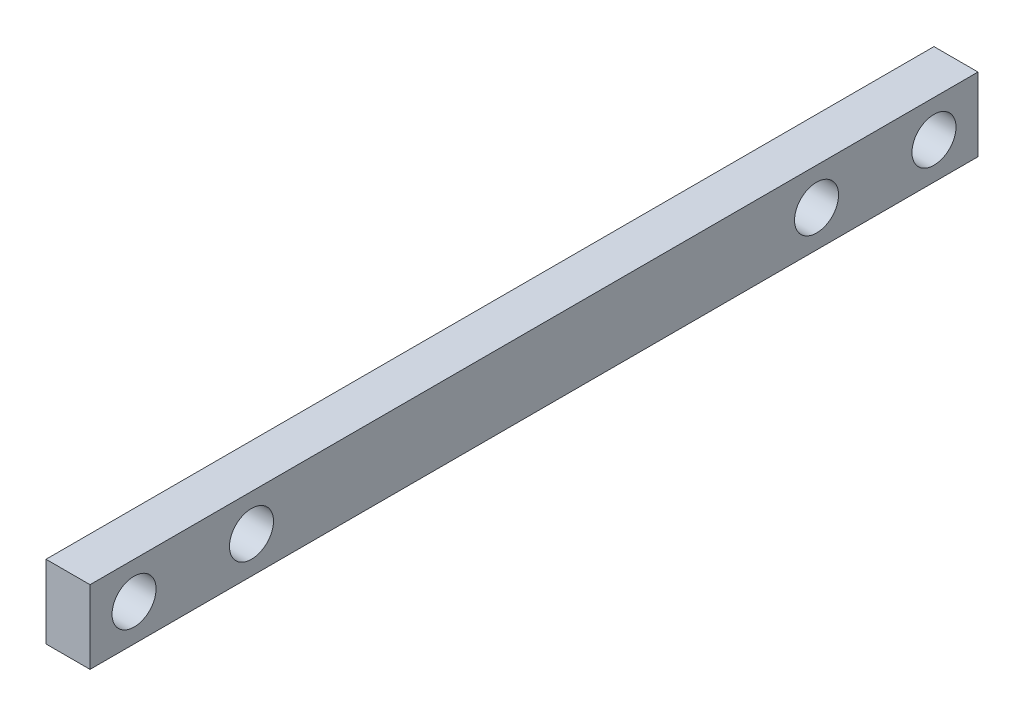
ISO-10303-21;
HEADER;
FILE_DESCRIPTION(('STEP AP214'),'2;1');
FILE_NAME('part.step','',(''),(''),'','','');
FILE_SCHEMA(('AUTOMOTIVE_DESIGN { 1 0 10303 214 1 1 1 1 }'));
ENDSEC;
DATA;
#1=APPLICATION_CONTEXT('core data for automotive mechanical design processes');
#2=APPLICATION_PROTOCOL_DEFINITION('international standard','automotive_design',2000,#1);
#3=PRODUCT_CONTEXT('',#1,'mechanical');
#4=PRODUCT('Part','Part','',(#3));
#5=PRODUCT_RELATED_PRODUCT_CATEGORY('part','',(#4));
#6=PRODUCT_DEFINITION_FORMATION('','',#4);
#7=PRODUCT_DEFINITION_CONTEXT('part definition',#1,'design');
#8=PRODUCT_DEFINITION('design','',#6,#7);
#9=PRODUCT_DEFINITION_SHAPE('','',#8);
#10=(LENGTH_UNIT() NAMED_UNIT(*) SI_UNIT(.MILLI.,.METRE.));
#11=(NAMED_UNIT(*) PLANE_ANGLE_UNIT() SI_UNIT($,.RADIAN.));
#12=(NAMED_UNIT(*) SI_UNIT($,.STERADIAN.) SOLID_ANGLE_UNIT());
#13=UNCERTAINTY_MEASURE_WITH_UNIT(LENGTH_MEASURE(1.E-05),#10,'distance_accuracy_value','');
#14=(GEOMETRIC_REPRESENTATION_CONTEXT(3) GLOBAL_UNCERTAINTY_ASSIGNED_CONTEXT((#13)) GLOBAL_UNIT_ASSIGNED_CONTEXT((#10,
#11,#12)) REPRESENTATION_CONTEXT('',''));
#15=CARTESIAN_POINT('',(0.,0.,0.));
#16=DIRECTION('',(0.,0.,1.));
#17=DIRECTION('',(1.,0.,0.));
#18=AXIS2_PLACEMENT_3D('',#15,#16,#17);
#19=CARTESIAN_POINT('',(3.,0.,0.));
#20=DIRECTION('',(-1.,0.,0.));
#21=DIRECTION('',(0.,0.,1.));
#22=AXIS2_PLACEMENT_3D('',#19,#20,#21);
#23=PLANE('',#22);
#24=DIRECTION('',(0.,1.,0.));
#25=VECTOR('',#24,1.);
#26=CARTESIAN_POINT('',(3.,-2.49999999999999,-30.25));
#27=LINE('',#26,#25);
#28=CARTESIAN_POINT('',(3.,-2.49999999999999,-30.25));
#29=VERTEX_POINT('',#28);
#30=CARTESIAN_POINT('',(3.,2.49999999999999,-30.25));
#31=VERTEX_POINT('',#30);
#32=EDGE_CURVE('E85',#29,#31,#27,.T.);
#33=ORIENTED_EDGE('',*,*,#32,.T.);
#34=DIRECTION('',(0.,0.,1.));
#35=VECTOR('',#34,1.);
#36=CARTESIAN_POINT('',(3.,2.49999999999999,30.25));
#37=LINE('',#36,#35);
#38=CARTESIAN_POINT('',(3.,2.49999999999999,30.25));
#39=VERTEX_POINT('',#38);
#40=EDGE_CURVE('E80',#31,#39,#37,.T.);
#41=ORIENTED_EDGE('',*,*,#40,.T.);
#42=DIRECTION('',(0.,-1.,0.));
#43=VECTOR('',#42,1.);
#44=CARTESIAN_POINT('',(3.,-2.5,30.25));
#45=LINE('',#44,#43);
#46=CARTESIAN_POINT('',(3.,-2.5,30.25));
#47=VERTEX_POINT('',#46);
#48=EDGE_CURVE('E83',#39,#47,#45,.T.);
#49=ORIENTED_EDGE('',*,*,#48,.T.);
#50=DIRECTION('',(0.,0.,-1.));
#51=VECTOR('',#50,1.);
#52=CARTESIAN_POINT('',(3.,-2.5,30.25));
#53=LINE('',#52,#51);
#54=EDGE_CURVE('E50',#47,#29,#53,.T.);
#55=ORIENTED_EDGE('',*,*,#54,.T.);
#56=EDGE_LOOP('',(#33,#41,#49,#55));
#57=FACE_BOUND('',#56,.T.);
#58=CARTESIAN_POINT('',(3.,0.,27.25));
#59=DIRECTION('',(1.,0.,0.));
#60=DIRECTION('',(0.,0.,-1.));
#61=AXIS2_PLACEMENT_3D('',#58,#59,#60);
#62=CIRCLE('',#61,1.5);
#63=CARTESIAN_POINT('',(3.,0.,25.75));
#64=VERTEX_POINT('',#63);
#65=EDGE_CURVE('E100',#64,#64,#62,.T.);
#66=ORIENTED_EDGE('',*,*,#65,.F.);
#67=EDGE_LOOP('',(#66));
#68=FACE_BOUND('',#67,.T.);
#69=CARTESIAN_POINT('',(3.,0.,19.25));
#70=DIRECTION('',(1.,0.,0.));
#71=DIRECTION('',(0.,0.,-1.));
#72=AXIS2_PLACEMENT_3D('',#69,#70,#71);
#73=CIRCLE('',#72,1.5);
#74=CARTESIAN_POINT('',(3.,0.,17.75));
#75=VERTEX_POINT('',#74);
#76=EDGE_CURVE('E115',#75,#75,#73,.T.);
#77=ORIENTED_EDGE('',*,*,#76,.F.);
#78=EDGE_LOOP('',(#77));
#79=FACE_BOUND('',#78,.T.);
#80=CARTESIAN_POINT('',(3.,0.,-27.25));
#81=DIRECTION('',(1.,0.,0.));
#82=DIRECTION('',(0.,0.,-1.));
#83=AXIS2_PLACEMENT_3D('',#80,#81,#82);
#84=CIRCLE('',#83,1.5);
#85=CARTESIAN_POINT('',(3.,0.,-28.75));
#86=VERTEX_POINT('',#85);
#87=EDGE_CURVE('E121',#86,#86,#84,.T.);
#88=ORIENTED_EDGE('',*,*,#87,.F.);
#89=EDGE_LOOP('',(#88));
#90=FACE_BOUND('',#89,.T.);
#91=CARTESIAN_POINT('',(3.,0.,-19.25));
#92=DIRECTION('',(1.,0.,0.));
#93=DIRECTION('',(0.,0.,-1.));
#94=AXIS2_PLACEMENT_3D('',#91,#92,#93);
#95=CIRCLE('',#94,1.5);
#96=CARTESIAN_POINT('',(3.,0.,-20.75));
#97=VERTEX_POINT('',#96);
#98=EDGE_CURVE('E127',#97,#97,#95,.T.);
#99=ORIENTED_EDGE('',*,*,#98,.F.);
#100=EDGE_LOOP('',(#99));
#101=FACE_BOUND('',#100,.T.);
#102=ADVANCED_FACE('F33',(#57,#68,#79,#90,#101),#23,.F.);
#103=CARTESIAN_POINT('',(0.,0.,0.));
#104=DIRECTION('',(-1.,0.,0.));
#105=DIRECTION('',(0.,0.,1.));
#106=AXIS2_PLACEMENT_3D('',#103,#104,#105);
#107=PLANE('',#106);
#108=CARTESIAN_POINT('',(0.,0.,-27.25));
#109=DIRECTION('',(1.,0.,0.));
#110=DIRECTION('',(0.,0.,-1.));
#111=AXIS2_PLACEMENT_3D('',#108,#109,#110);
#112=CIRCLE('',#111,1.5);
#113=CARTESIAN_POINT('',(0.,0.,-28.75));
#114=VERTEX_POINT('',#113);
#115=EDGE_CURVE('E124',#114,#114,#112,.T.);
#116=ORIENTED_EDGE('',*,*,#115,.T.);
#117=EDGE_LOOP('',(#116));
#118=FACE_BOUND('',#117,.T.);
#119=CARTESIAN_POINT('',(0.,0.,27.25));
#120=DIRECTION('',(1.,0.,0.));
#121=DIRECTION('',(0.,0.,-1.));
#122=AXIS2_PLACEMENT_3D('',#119,#120,#121);
#123=CIRCLE('',#122,1.5);
#124=CARTESIAN_POINT('',(0.,0.,25.75));
#125=VERTEX_POINT('',#124);
#126=EDGE_CURVE('E112',#125,#125,#123,.T.);
#127=ORIENTED_EDGE('',*,*,#126,.T.);
#128=EDGE_LOOP('',(#127));
#129=FACE_BOUND('',#128,.T.);
#130=DIRECTION('',(0.,1.,0.));
#131=VECTOR('',#130,1.);
#132=CARTESIAN_POINT('',(0.,-2.49999999999999,-30.25));
#133=LINE('',#132,#131);
#134=CARTESIAN_POINT('',(0.,-2.49999999999999,-30.25));
#135=VERTEX_POINT('',#134);
#136=CARTESIAN_POINT('',(0.,2.49999999999999,-30.25));
#137=VERTEX_POINT('',#136);
#138=EDGE_CURVE('E97',#135,#137,#133,.T.);
#139=ORIENTED_EDGE('',*,*,#138,.F.);
#140=DIRECTION('',(0.,0.,-1.));
#141=VECTOR('',#140,1.);
#142=CARTESIAN_POINT('',(0.,-2.5,30.25));
#143=LINE('',#142,#141);
#144=CARTESIAN_POINT('',(0.,-2.5,30.25));
#145=VERTEX_POINT('',#144);
#146=EDGE_CURVE('E73',#145,#135,#143,.T.);
#147=ORIENTED_EDGE('',*,*,#146,.F.);
#148=DIRECTION('',(0.,-1.,0.));
#149=VECTOR('',#148,1.);
#150=CARTESIAN_POINT('',(0.,-2.5,30.25));
#151=LINE('',#150,#149);
#152=CARTESIAN_POINT('',(0.,2.49999999999999,30.25));
#153=VERTEX_POINT('',#152);
#154=EDGE_CURVE('E67',#153,#145,#151,.T.);
#155=ORIENTED_EDGE('',*,*,#154,.F.);
#156=DIRECTION('',(0.,0.,1.));
#157=VECTOR('',#156,1.);
#158=CARTESIAN_POINT('',(0.,2.49999999999999,30.25));
#159=LINE('',#158,#157);
#160=EDGE_CURVE('E89',#137,#153,#159,.T.);
#161=ORIENTED_EDGE('',*,*,#160,.F.);
#162=EDGE_LOOP('',(#139,#147,#155,#161));
#163=FACE_BOUND('',#162,.T.);
#164=CARTESIAN_POINT('',(0.,0.,19.25));
#165=DIRECTION('',(1.,0.,0.));
#166=DIRECTION('',(0.,0.,-1.));
#167=AXIS2_PLACEMENT_3D('',#164,#165,#166);
#168=CIRCLE('',#167,1.5);
#169=CARTESIAN_POINT('',(0.,0.,17.75));
#170=VERTEX_POINT('',#169);
#171=EDGE_CURVE('E118',#170,#170,#168,.T.);
#172=ORIENTED_EDGE('',*,*,#171,.T.);
#173=EDGE_LOOP('',(#172));
#174=FACE_BOUND('',#173,.T.);
#175=CARTESIAN_POINT('',(0.,0.,-19.25));
#176=DIRECTION('',(1.,0.,0.));
#177=DIRECTION('',(0.,0.,-1.));
#178=AXIS2_PLACEMENT_3D('',#175,#176,#177);
#179=CIRCLE('',#178,1.5);
#180=CARTESIAN_POINT('',(0.,0.,-20.75));
#181=VERTEX_POINT('',#180);
#182=EDGE_CURVE('E130',#181,#181,#179,.T.);
#183=ORIENTED_EDGE('',*,*,#182,.T.);
#184=EDGE_LOOP('',(#183));
#185=FACE_BOUND('',#184,.T.);
#186=ADVANCED_FACE('F108',(#118,#129,#163,#174,#185),#107,.T.);
#187=CARTESIAN_POINT('',(3.,-2.49999999999999,-30.25));
#188=DIRECTION('',(0.,0.,1.));
#189=DIRECTION('',(1.,0.,0.));
#190=AXIS2_PLACEMENT_3D('',#187,#188,#189);
#191=PLANE('',#190);
#192=ORIENTED_EDGE('',*,*,#138,.T.);
#193=DIRECTION('',(-1.,0.,0.));
#194=VECTOR('',#193,1.);
#195=CARTESIAN_POINT('',(3.,2.49999999999999,-30.25));
#196=LINE('',#195,#194);
#197=EDGE_CURVE('E11',#31,#137,#196,.T.);
#198=ORIENTED_EDGE('',*,*,#197,.F.);
#199=ORIENTED_EDGE('',*,*,#32,.F.);
#200=DIRECTION('',(-1.,0.,0.));
#201=VECTOR('',#200,1.);
#202=CARTESIAN_POINT('',(3.,-2.49999999999999,-30.25));
#203=LINE('',#202,#201);
#204=EDGE_CURVE('E93',#29,#135,#203,.T.);
#205=ORIENTED_EDGE('',*,*,#204,.T.);
#206=EDGE_LOOP('',(#192,#198,#199,#205));
#207=FACE_BOUND('',#206,.T.);
#208=ADVANCED_FACE('F35',(#207),#191,.F.);
#209=CARTESIAN_POINT('',(3.,2.49999999999999,30.25));
#210=DIRECTION('',(0.,-1.,0.));
#211=DIRECTION('',(0.,0.,-1.));
#212=AXIS2_PLACEMENT_3D('',#209,#210,#211);
#213=PLANE('',#212);
#214=ORIENTED_EDGE('',*,*,#160,.T.);
#215=DIRECTION('',(-1.,0.,0.));
#216=VECTOR('',#215,1.);
#217=CARTESIAN_POINT('',(3.,2.49999999999999,30.25));
#218=LINE('',#217,#216);
#219=EDGE_CURVE('E42',#39,#153,#218,.T.);
#220=ORIENTED_EDGE('',*,*,#219,.F.);
#221=ORIENTED_EDGE('',*,*,#40,.F.);
#222=ORIENTED_EDGE('',*,*,#197,.T.);
#223=EDGE_LOOP('',(#214,#220,#221,#222));
#224=FACE_BOUND('',#223,.T.);
#225=ADVANCED_FACE('F88',(#224),#213,.F.);
#226=CARTESIAN_POINT('',(3.,-2.5,30.25));
#227=DIRECTION('',(0.,0.,-1.));
#228=DIRECTION('',(-1.,0.,0.));
#229=AXIS2_PLACEMENT_3D('',#226,#227,#228);
#230=PLANE('',#229);
#231=ORIENTED_EDGE('',*,*,#154,.T.);
#232=DIRECTION('',(-1.,0.,0.));
#233=VECTOR('',#232,1.);
#234=CARTESIAN_POINT('',(3.,-2.5,30.25));
#235=LINE('',#234,#233);
#236=EDGE_CURVE('E90',#47,#145,#235,.T.);
#237=ORIENTED_EDGE('',*,*,#236,.F.);
#238=ORIENTED_EDGE('',*,*,#48,.F.);
#239=ORIENTED_EDGE('',*,*,#219,.T.);
#240=EDGE_LOOP('',(#231,#237,#238,#239));
#241=FACE_BOUND('',#240,.T.);
#242=ADVANCED_FACE('F91',(#241),#230,.F.);
#243=CARTESIAN_POINT('',(3.,-2.5,30.25));
#244=DIRECTION('',(0.,1.,0.));
#245=DIRECTION('',(0.,0.,1.));
#246=AXIS2_PLACEMENT_3D('',#243,#244,#245);
#247=PLANE('',#246);
#248=ORIENTED_EDGE('',*,*,#146,.T.);
#249=ORIENTED_EDGE('',*,*,#204,.F.);
#250=ORIENTED_EDGE('',*,*,#54,.F.);
#251=ORIENTED_EDGE('',*,*,#236,.T.);
#252=EDGE_LOOP('',(#248,#249,#250,#251));
#253=FACE_BOUND('',#252,.T.);
#254=ADVANCED_FACE('F105',(#253),#247,.F.);
#255=CARTESIAN_POINT('',(3.,0.,27.25));
#256=DIRECTION('',(-1.,0.,0.));
#257=DIRECTION('',(0.,0.,1.));
#258=AXIS2_PLACEMENT_3D('',#255,#256,#257);
#259=CYLINDRICAL_SURFACE('',#258,1.5);
#260=ORIENTED_EDGE('',*,*,#65,.T.);
#261=EDGE_LOOP('',(#260));
#262=FACE_BOUND('',#261,.T.);
#263=ORIENTED_EDGE('',*,*,#126,.F.);
#264=EDGE_LOOP('',(#263));
#265=FACE_BOUND('',#264,.T.);
#266=ADVANCED_FACE('F147',(#262,#265),#259,.F.);
#267=CARTESIAN_POINT('',(3.,0.,19.25));
#268=DIRECTION('',(-1.,0.,0.));
#269=DIRECTION('',(0.,0.,1.));
#270=AXIS2_PLACEMENT_3D('',#267,#268,#269);
#271=CYLINDRICAL_SURFACE('',#270,1.5);
#272=ORIENTED_EDGE('',*,*,#76,.T.);
#273=EDGE_LOOP('',(#272));
#274=FACE_BOUND('',#273,.T.);
#275=ORIENTED_EDGE('',*,*,#171,.F.);
#276=EDGE_LOOP('',(#275));
#277=FACE_BOUND('',#276,.T.);
#278=ADVANCED_FACE('F193',(#274,#277),#271,.F.);
#279=CARTESIAN_POINT('',(3.,0.,-27.25));
#280=DIRECTION('',(-1.,0.,0.));
#281=DIRECTION('',(0.,0.,1.));
#282=AXIS2_PLACEMENT_3D('',#279,#280,#281);
#283=CYLINDRICAL_SURFACE('',#282,1.5);
#284=ORIENTED_EDGE('',*,*,#87,.T.);
#285=EDGE_LOOP('',(#284));
#286=FACE_BOUND('',#285,.T.);
#287=ORIENTED_EDGE('',*,*,#115,.F.);
#288=EDGE_LOOP('',(#287));
#289=FACE_BOUND('',#288,.T.);
#290=ADVANCED_FACE('F201',(#286,#289),#283,.F.);
#291=CARTESIAN_POINT('',(3.,0.,-19.25));
#292=DIRECTION('',(-1.,0.,0.));
#293=DIRECTION('',(0.,0.,1.));
#294=AXIS2_PLACEMENT_3D('',#291,#292,#293);
#295=CYLINDRICAL_SURFACE('',#294,1.5);
#296=ORIENTED_EDGE('',*,*,#98,.T.);
#297=EDGE_LOOP('',(#296));
#298=FACE_BOUND('',#297,.T.);
#299=ORIENTED_EDGE('',*,*,#182,.F.);
#300=EDGE_LOOP('',(#299));
#301=FACE_BOUND('',#300,.T.);
#302=ADVANCED_FACE('F136',(#298,#301),#295,.F.);
#303=CLOSED_SHELL('',(#102,#186,#208,#225,#242,#254,#266,#278,#290,#302));
#304=MANIFOLD_SOLID_BREP('B2',#303);
#305=ADVANCED_BREP_SHAPE_REPRESENTATION('',(#18,#304),#14);
#306=SHAPE_DEFINITION_REPRESENTATION(#9,#305);
ENDSEC;
END-ISO-10303-21;
